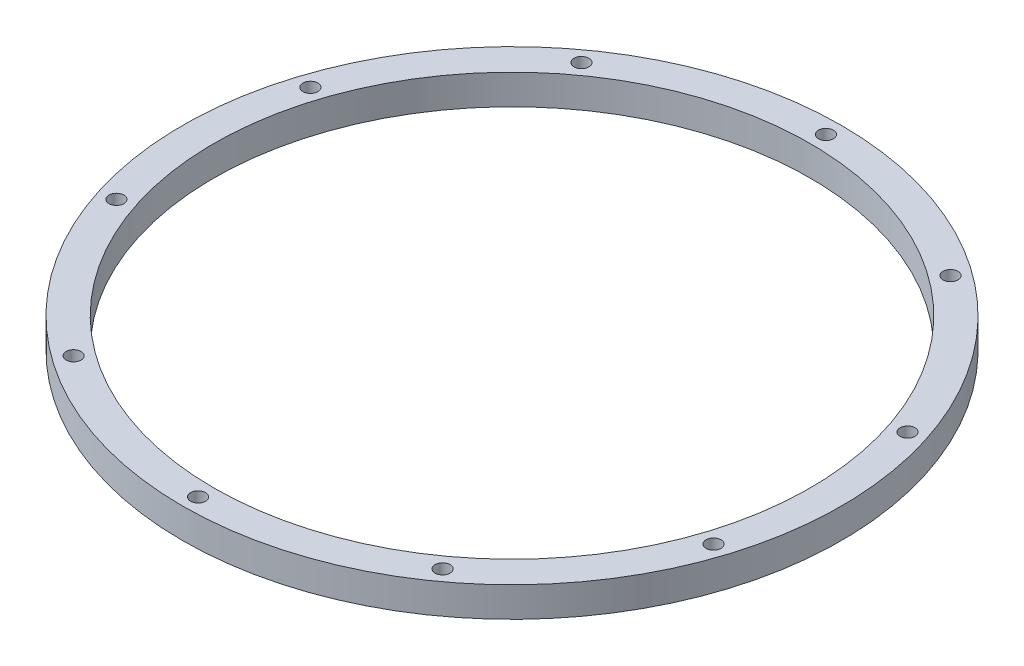
ISO-10303-21;
HEADER;
FILE_DESCRIPTION(('STEP AP214'),'2;1');
FILE_NAME('part.step','',(''),(''),'','','');
FILE_SCHEMA(('AUTOMOTIVE_DESIGN { 1 0 10303 214 1 1 1 1 }'));
ENDSEC;
DATA;
#1=APPLICATION_CONTEXT('core data for automotive mechanical design processes');
#2=APPLICATION_PROTOCOL_DEFINITION('international standard','automotive_design',2000,#1);
#3=PRODUCT_CONTEXT('',#1,'mechanical');
#4=PRODUCT('Part','Part','',(#3));
#5=PRODUCT_RELATED_PRODUCT_CATEGORY('part','',(#4));
#6=PRODUCT_DEFINITION_FORMATION('','',#4);
#7=PRODUCT_DEFINITION_CONTEXT('part definition',#1,'design');
#8=PRODUCT_DEFINITION('design','',#6,#7);
#9=PRODUCT_DEFINITION_SHAPE('','',#8);
#10=(LENGTH_UNIT() NAMED_UNIT(*) SI_UNIT(.MILLI.,.METRE.));
#11=(NAMED_UNIT(*) PLANE_ANGLE_UNIT() SI_UNIT($,.RADIAN.));
#12=(NAMED_UNIT(*) SI_UNIT($,.STERADIAN.) SOLID_ANGLE_UNIT());
#13=UNCERTAINTY_MEASURE_WITH_UNIT(LENGTH_MEASURE(1.E-05),#10,'distance_accuracy_value','');
#14=(GEOMETRIC_REPRESENTATION_CONTEXT(3) GLOBAL_UNCERTAINTY_ASSIGNED_CONTEXT((#13)) GLOBAL_UNIT_ASSIGNED_CONTEXT((#10,
#11,#12)) REPRESENTATION_CONTEXT('',''));
#15=CARTESIAN_POINT('',(0.,0.,0.));
#16=DIRECTION('',(0.,0.,1.));
#17=DIRECTION('',(1.,0.,0.));
#18=AXIS2_PLACEMENT_3D('',#15,#16,#17);
#19=CARTESIAN_POINT('',(0.,22.45,0.));
#20=DIRECTION('',(0.,1.,0.));
#21=DIRECTION('',(0.,0.,1.));
#22=AXIS2_PLACEMENT_3D('',#19,#20,#21);
#23=PLANE('',#22);
#24=CARTESIAN_POINT('',(-138.261785970494,22.45,190.301022501849));
#25=DIRECTION('',(0.,1.,0.));
#26=DIRECTION('',(-0.587785252292462,0.,0.809016994374955));
#27=AXIS2_PLACEMENT_3D('',#24,#25,#26);
#28=CIRCLE('',#27,5.6125);
#29=CARTESIAN_POINT('',(-141.560730698986,22.45,194.841630382778));
#30=VERTEX_POINT('',#29);
#31=EDGE_CURVE('E108',#30,#30,#28,.T.);
#32=ORIENTED_EDGE('',*,*,#31,.F.);
#33=EDGE_LOOP('',(#32));
#34=FACE_BOUND('',#33,.T.);
#35=CARTESIAN_POINT('',(-223.712269045527,22.45,72.6885225018495));
#36=DIRECTION('',(0.,1.,0.));
#37=DIRECTION('',(-0.95105651629515,0.,0.309016994374958));
#38=AXIS2_PLACEMENT_3D('',#35,#36,#37);
#39=CIRCLE('',#38,5.6125);
#40=CARTESIAN_POINT('',(-229.050073743233,22.45,74.422880382779));
#41=VERTEX_POINT('',#40);
#42=EDGE_CURVE('E102',#41,#41,#39,.T.);
#43=ORIENTED_EDGE('',*,*,#42,.F.);
#44=EDGE_LOOP('',(#43));
#45=FACE_BOUND('',#44,.T.);
#46=CARTESIAN_POINT('',(-223.712269045528,22.45,-72.6885225018449));
#47=DIRECTION('',(0.,1.,0.));
#48=DIRECTION('',(-0.951056516295157,0.,-0.309016994374938));
#49=AXIS2_PLACEMENT_3D('',#46,#47,#48);
#50=CIRCLE('',#49,5.6125);
#51=CARTESIAN_POINT('',(-229.050073743235,22.45,-74.4228803827742));
#52=VERTEX_POINT('',#51);
#53=EDGE_CURVE('E96',#52,#52,#50,.T.);
#54=ORIENTED_EDGE('',*,*,#53,.F.);
#55=EDGE_LOOP('',(#54));
#56=FACE_BOUND('',#55,.T.);
#57=CARTESIAN_POINT('',(-138.261785970499,22.45,-190.301022501846));
#58=DIRECTION('',(0.,1.,0.));
#59=DIRECTION('',(-0.58778525229248,0.,-0.809016994374942));
#60=AXIS2_PLACEMENT_3D('',#57,#58,#59);
#61=CIRCLE('',#60,5.6125);
#62=CARTESIAN_POINT('',(-141.56073069899,22.45,-194.841630382775));
#63=VERTEX_POINT('',#62);
#64=EDGE_CURVE('E90',#63,#63,#61,.T.);
#65=ORIENTED_EDGE('',*,*,#64,.F.);
#66=EDGE_LOOP('',(#65));
#67=FACE_BOUND('',#66,.T.);
#68=CARTESIAN_POINT('',(0.,22.45,-235.225));
#69=DIRECTION('',(0.,1.,0.));
#70=DIRECTION('',(0.,0.,-1.));
#71=AXIS2_PLACEMENT_3D('',#68,#69,#70);
#72=CIRCLE('',#71,5.6125);
#73=CARTESIAN_POINT('',(0.,22.45,-240.8375));
#74=VERTEX_POINT('',#73);
#75=EDGE_CURVE('E84',#74,#74,#72,.T.);
#76=ORIENTED_EDGE('',*,*,#75,.F.);
#77=EDGE_LOOP('',(#76));
#78=FACE_BOUND('',#77,.T.);
#79=CARTESIAN_POINT('',(138.261785970496,22.45,-190.301022501848));
#80=DIRECTION('',(0.,1.,0.));
#81=DIRECTION('',(0.587785252292469,0.,-0.809016994374951));
#82=AXIS2_PLACEMENT_3D('',#79,#80,#81);
#83=CIRCLE('',#82,5.6125);
#84=CARTESIAN_POINT('',(141.560730698987,22.45,-194.841630382777));
#85=VERTEX_POINT('',#84);
#86=EDGE_CURVE('E78',#85,#85,#83,.T.);
#87=ORIENTED_EDGE('',*,*,#86,.F.);
#88=EDGE_LOOP('',(#87));
#89=FACE_BOUND('',#88,.T.);
#90=CARTESIAN_POINT('',(223.712269045527,22.45,-72.688522501848));
#91=DIRECTION('',(0.,1.,0.));
#92=DIRECTION('',(0.951056516295152,0.,-0.309016994374952));
#93=AXIS2_PLACEMENT_3D('',#90,#91,#92);
#94=CIRCLE('',#93,5.6125);
#95=CARTESIAN_POINT('',(229.050073743234,22.45,-74.4228803827774));
#96=VERTEX_POINT('',#95);
#97=EDGE_CURVE('E72',#96,#96,#94,.T.);
#98=ORIENTED_EDGE('',*,*,#97,.F.);
#99=EDGE_LOOP('',(#98));
#100=FACE_BOUND('',#99,.T.);
#101=CARTESIAN_POINT('',(223.712269045528,22.45,72.6885225018464));
#102=DIRECTION('',(0.,1.,0.));
#103=DIRECTION('',(0.951056516295155,0.,0.309016994374945));
#104=AXIS2_PLACEMENT_3D('',#101,#102,#103);
#105=CIRCLE('',#104,5.6125);
#106=CARTESIAN_POINT('',(229.050073743234,22.45,74.4228803827758));
#107=VERTEX_POINT('',#106);
#108=EDGE_CURVE('E66',#107,#107,#105,.T.);
#109=ORIENTED_EDGE('',*,*,#108,.F.);
#110=EDGE_LOOP('',(#109));
#111=FACE_BOUND('',#110,.T.);
#112=CARTESIAN_POINT('',(138.261785970497,22.45,190.301022501847));
#113=DIRECTION('',(0.,1.,0.));
#114=DIRECTION('',(0.587785252292474,0.,0.809016994374947));
#115=AXIS2_PLACEMENT_3D('',#112,#113,#114);
#116=CIRCLE('',#115,5.6125);
#117=CARTESIAN_POINT('',(141.560730698989,22.45,194.841630382776));
#118=VERTEX_POINT('',#117);
#119=EDGE_CURVE('E60',#118,#118,#116,.T.);
#120=ORIENTED_EDGE('',*,*,#119,.F.);
#121=EDGE_LOOP('',(#120));
#122=FACE_BOUND('',#121,.T.);
#123=CARTESIAN_POINT('',(0.,22.45,235.225));
#124=DIRECTION('',(0.,1.,0.));
#125=DIRECTION('',(0.,0.,1.));
#126=AXIS2_PLACEMENT_3D('',#123,#124,#125);
#127=CIRCLE('',#126,5.6125);
#128=CARTESIAN_POINT('',(0.,22.45,240.8375));
#129=VERTEX_POINT('',#128);
#130=EDGE_CURVE('E54',#129,#129,#127,.T.);
#131=ORIENTED_EDGE('',*,*,#130,.F.);
#132=EDGE_LOOP('',(#131));
#133=FACE_BOUND('',#132,.T.);
#134=CARTESIAN_POINT('',(0.,22.45,0.));
#135=DIRECTION('',(0.,1.,0.));
#136=DIRECTION('',(0.,0.,1.));
#137=AXIS2_PLACEMENT_3D('',#134,#135,#136);
#138=CIRCLE('',#137,246.95);
#139=CARTESIAN_POINT('',(0.,22.45,246.95));
#140=VERTEX_POINT('',#139);
#141=EDGE_CURVE('E11',#140,#140,#138,.T.);
#142=ORIENTED_EDGE('',*,*,#141,.T.);
#143=EDGE_LOOP('',(#142));
#144=FACE_BOUND('',#143,.T.);
#145=CARTESIAN_POINT('',(0.,22.45,0.));
#146=DIRECTION('',(0.,1.,0.));
#147=DIRECTION('',(0.,0.,1.));
#148=AXIS2_PLACEMENT_3D('',#145,#146,#147);
#149=CIRCLE('',#148,223.5);
#150=CARTESIAN_POINT('',(0.,22.45,223.5));
#151=VERTEX_POINT('',#150);
#152=EDGE_CURVE('E49',#151,#151,#149,.T.);
#153=ORIENTED_EDGE('',*,*,#152,.F.);
#154=EDGE_LOOP('',(#153));
#155=FACE_BOUND('',#154,.T.);
#156=ADVANCED_FACE('F38',(#34,#45,#56,#67,#78,#89,#100,#111,#122,#133,#144,#155),#23,.T.);
#157=CARTESIAN_POINT('',(0.,0.,0.));
#158=DIRECTION('',(0.,1.,0.));
#159=DIRECTION('',(0.,0.,1.));
#160=AXIS2_PLACEMENT_3D('',#157,#158,#159);
#161=PLANE('',#160);
#162=CARTESIAN_POINT('',(-138.261785970494,0.,190.301022501849));
#163=DIRECTION('',(0.,1.,0.));
#164=DIRECTION('',(-0.587785252292462,0.,0.809016994374955));
#165=AXIS2_PLACEMENT_3D('',#162,#163,#164);
#166=CIRCLE('',#165,5.6125);
#167=CARTESIAN_POINT('',(-141.560730698986,0.,194.841630382778));
#168=VERTEX_POINT('',#167);
#169=EDGE_CURVE('E111',#168,#168,#166,.T.);
#170=ORIENTED_EDGE('',*,*,#169,.T.);
#171=EDGE_LOOP('',(#170));
#172=FACE_BOUND('',#171,.T.);
#173=CARTESIAN_POINT('',(-223.712269045527,0.,72.6885225018495));
#174=DIRECTION('',(0.,1.,0.));
#175=DIRECTION('',(-0.95105651629515,0.,0.309016994374958));
#176=AXIS2_PLACEMENT_3D('',#173,#174,#175);
#177=CIRCLE('',#176,5.6125);
#178=CARTESIAN_POINT('',(-229.050073743233,0.,74.422880382779));
#179=VERTEX_POINT('',#178);
#180=EDGE_CURVE('E105',#179,#179,#177,.T.);
#181=ORIENTED_EDGE('',*,*,#180,.T.);
#182=EDGE_LOOP('',(#181));
#183=FACE_BOUND('',#182,.T.);
#184=CARTESIAN_POINT('',(-223.712269045528,0.,-72.6885225018449));
#185=DIRECTION('',(0.,1.,0.));
#186=DIRECTION('',(-0.951056516295157,0.,-0.309016994374938));
#187=AXIS2_PLACEMENT_3D('',#184,#185,#186);
#188=CIRCLE('',#187,5.6125);
#189=CARTESIAN_POINT('',(-229.050073743235,0.,-74.4228803827742));
#190=VERTEX_POINT('',#189);
#191=EDGE_CURVE('E99',#190,#190,#188,.T.);
#192=ORIENTED_EDGE('',*,*,#191,.T.);
#193=EDGE_LOOP('',(#192));
#194=FACE_BOUND('',#193,.T.);
#195=CARTESIAN_POINT('',(-138.261785970499,0.,-190.301022501846));
#196=DIRECTION('',(0.,1.,0.));
#197=DIRECTION('',(-0.58778525229248,0.,-0.809016994374942));
#198=AXIS2_PLACEMENT_3D('',#195,#196,#197);
#199=CIRCLE('',#198,5.6125);
#200=CARTESIAN_POINT('',(-141.56073069899,0.,-194.841630382775));
#201=VERTEX_POINT('',#200);
#202=EDGE_CURVE('E93',#201,#201,#199,.T.);
#203=ORIENTED_EDGE('',*,*,#202,.T.);
#204=EDGE_LOOP('',(#203));
#205=FACE_BOUND('',#204,.T.);
#206=CARTESIAN_POINT('',(0.,0.,-235.225));
#207=DIRECTION('',(0.,1.,0.));
#208=DIRECTION('',(0.,0.,-1.));
#209=AXIS2_PLACEMENT_3D('',#206,#207,#208);
#210=CIRCLE('',#209,5.6125);
#211=CARTESIAN_POINT('',(0.,0.,-240.8375));
#212=VERTEX_POINT('',#211);
#213=EDGE_CURVE('E87',#212,#212,#210,.T.);
#214=ORIENTED_EDGE('',*,*,#213,.T.);
#215=EDGE_LOOP('',(#214));
#216=FACE_BOUND('',#215,.T.);
#217=CARTESIAN_POINT('',(138.261785970496,0.,-190.301022501848));
#218=DIRECTION('',(0.,1.,0.));
#219=DIRECTION('',(0.587785252292469,0.,-0.809016994374951));
#220=AXIS2_PLACEMENT_3D('',#217,#218,#219);
#221=CIRCLE('',#220,5.6125);
#222=CARTESIAN_POINT('',(141.560730698987,0.,-194.841630382777));
#223=VERTEX_POINT('',#222);
#224=EDGE_CURVE('E81',#223,#223,#221,.T.);
#225=ORIENTED_EDGE('',*,*,#224,.T.);
#226=EDGE_LOOP('',(#225));
#227=FACE_BOUND('',#226,.T.);
#228=CARTESIAN_POINT('',(223.712269045527,0.,-72.688522501848));
#229=DIRECTION('',(0.,1.,0.));
#230=DIRECTION('',(0.951056516295152,0.,-0.309016994374952));
#231=AXIS2_PLACEMENT_3D('',#228,#229,#230);
#232=CIRCLE('',#231,5.6125);
#233=CARTESIAN_POINT('',(229.050073743234,0.,-74.4228803827774));
#234=VERTEX_POINT('',#233);
#235=EDGE_CURVE('E75',#234,#234,#232,.T.);
#236=ORIENTED_EDGE('',*,*,#235,.T.);
#237=EDGE_LOOP('',(#236));
#238=FACE_BOUND('',#237,.T.);
#239=CARTESIAN_POINT('',(223.712269045528,0.,72.6885225018464));
#240=DIRECTION('',(0.,1.,0.));
#241=DIRECTION('',(0.951056516295155,0.,0.309016994374945));
#242=AXIS2_PLACEMENT_3D('',#239,#240,#241);
#243=CIRCLE('',#242,5.6125);
#244=CARTESIAN_POINT('',(229.050073743234,0.,74.4228803827758));
#245=VERTEX_POINT('',#244);
#246=EDGE_CURVE('E69',#245,#245,#243,.T.);
#247=ORIENTED_EDGE('',*,*,#246,.T.);
#248=EDGE_LOOP('',(#247));
#249=FACE_BOUND('',#248,.T.);
#250=CARTESIAN_POINT('',(138.261785970497,0.,190.301022501847));
#251=DIRECTION('',(0.,1.,0.));
#252=DIRECTION('',(0.587785252292474,0.,0.809016994374947));
#253=AXIS2_PLACEMENT_3D('',#250,#251,#252);
#254=CIRCLE('',#253,5.6125);
#255=CARTESIAN_POINT('',(141.560730698989,0.,194.841630382776));
#256=VERTEX_POINT('',#255);
#257=EDGE_CURVE('E63',#256,#256,#254,.T.);
#258=ORIENTED_EDGE('',*,*,#257,.T.);
#259=EDGE_LOOP('',(#258));
#260=FACE_BOUND('',#259,.T.);
#261=CARTESIAN_POINT('',(0.,0.,235.225));
#262=DIRECTION('',(0.,1.,0.));
#263=DIRECTION('',(0.,0.,1.));
#264=AXIS2_PLACEMENT_3D('',#261,#262,#263);
#265=CIRCLE('',#264,5.6125);
#266=CARTESIAN_POINT('',(0.,0.,240.8375));
#267=VERTEX_POINT('',#266);
#268=EDGE_CURVE('E57',#267,#267,#265,.T.);
#269=ORIENTED_EDGE('',*,*,#268,.T.);
#270=EDGE_LOOP('',(#269));
#271=FACE_BOUND('',#270,.T.);
#272=CARTESIAN_POINT('',(0.,0.,0.));
#273=DIRECTION('',(0.,1.,0.));
#274=DIRECTION('',(0.,0.,1.));
#275=AXIS2_PLACEMENT_3D('',#272,#273,#274);
#276=CIRCLE('',#275,246.95);
#277=CARTESIAN_POINT('',(0.,0.,246.95));
#278=VERTEX_POINT('',#277);
#279=EDGE_CURVE('E42',#278,#278,#276,.T.);
#280=ORIENTED_EDGE('',*,*,#279,.F.);
#281=EDGE_LOOP('',(#280));
#282=FACE_BOUND('',#281,.T.);
#283=CARTESIAN_POINT('',(0.,0.,0.));
#284=DIRECTION('',(0.,1.,0.));
#285=DIRECTION('',(0.,0.,1.));
#286=AXIS2_PLACEMENT_3D('',#283,#284,#285);
#287=CIRCLE('',#286,223.5);
#288=CARTESIAN_POINT('',(0.,0.,223.5));
#289=VERTEX_POINT('',#288);
#290=EDGE_CURVE('E51',#289,#289,#287,.T.);
#291=ORIENTED_EDGE('',*,*,#290,.T.);
#292=EDGE_LOOP('',(#291));
#293=FACE_BOUND('',#292,.T.);
#294=ADVANCED_FACE('F122',(#172,#183,#194,#205,#216,#227,#238,#249,#260,#271,#282,#293),#161,.F.);
#295=CARTESIAN_POINT('',(0.,22.45,0.));
#296=DIRECTION('',(0.,-1.,0.));
#297=DIRECTION('',(0.,0.,-1.));
#298=AXIS2_PLACEMENT_3D('',#295,#296,#297);
#299=CYLINDRICAL_SURFACE('',#298,246.95);
#300=ORIENTED_EDGE('',*,*,#141,.F.);
#301=EDGE_LOOP('',(#300));
#302=FACE_BOUND('',#301,.T.);
#303=ORIENTED_EDGE('',*,*,#279,.T.);
#304=EDGE_LOOP('',(#303));
#305=FACE_BOUND('',#304,.T.);
#306=ADVANCED_FACE('F40',(#302,#305),#299,.T.);
#307=CARTESIAN_POINT('',(0.,22.45,0.));
#308=DIRECTION('',(0.,-1.,0.));
#309=DIRECTION('',(0.,0.,-1.));
#310=AXIS2_PLACEMENT_3D('',#307,#308,#309);
#311=CYLINDRICAL_SURFACE('',#310,223.5);
#312=ORIENTED_EDGE('',*,*,#152,.T.);
#313=EDGE_LOOP('',(#312));
#314=FACE_BOUND('',#313,.T.);
#315=ORIENTED_EDGE('',*,*,#290,.F.);
#316=EDGE_LOOP('',(#315));
#317=FACE_BOUND('',#316,.T.);
#318=ADVANCED_FACE('F144',(#314,#317),#311,.F.);
#319=CARTESIAN_POINT('',(0.,22.45,235.225));
#320=DIRECTION('',(0.,-1.,0.));
#321=DIRECTION('',(0.,0.,-1.));
#322=AXIS2_PLACEMENT_3D('',#319,#320,#321);
#323=CYLINDRICAL_SURFACE('',#322,5.6125);
#324=ORIENTED_EDGE('',*,*,#130,.T.);
#325=EDGE_LOOP('',(#324));
#326=FACE_BOUND('',#325,.T.);
#327=ORIENTED_EDGE('',*,*,#268,.F.);
#328=EDGE_LOOP('',(#327));
#329=FACE_BOUND('',#328,.T.);
#330=ADVANCED_FACE('F147',(#326,#329),#323,.F.);
#331=CARTESIAN_POINT('',(138.261785970497,22.45,190.301022501847));
#332=DIRECTION('',(0.,-1.,0.));
#333=DIRECTION('',(0.,0.,-1.));
#334=AXIS2_PLACEMENT_3D('',#331,#332,#333);
#335=CYLINDRICAL_SURFACE('',#334,5.6125);
#336=ORIENTED_EDGE('',*,*,#119,.T.);
#337=EDGE_LOOP('',(#336));
#338=FACE_BOUND('',#337,.T.);
#339=ORIENTED_EDGE('',*,*,#257,.F.);
#340=EDGE_LOOP('',(#339));
#341=FACE_BOUND('',#340,.T.);
#342=ADVANCED_FACE('F161',(#338,#341),#335,.F.);
#343=CARTESIAN_POINT('',(223.712269045528,22.45,72.6885225018464));
#344=DIRECTION('',(0.,-1.,0.));
#345=DIRECTION('',(0.,0.,-1.));
#346=AXIS2_PLACEMENT_3D('',#343,#344,#345);
#347=CYLINDRICAL_SURFACE('',#346,5.6125);
#348=ORIENTED_EDGE('',*,*,#108,.T.);
#349=EDGE_LOOP('',(#348));
#350=FACE_BOUND('',#349,.T.);
#351=ORIENTED_EDGE('',*,*,#246,.F.);
#352=EDGE_LOOP('',(#351));
#353=FACE_BOUND('',#352,.T.);
#354=ADVANCED_FACE('F165',(#350,#353),#347,.F.);
#355=CARTESIAN_POINT('',(223.712269045527,22.45,-72.688522501848));
#356=DIRECTION('',(0.,-1.,0.));
#357=DIRECTION('',(0.,0.,-1.));
#358=AXIS2_PLACEMENT_3D('',#355,#356,#357);
#359=CYLINDRICAL_SURFACE('',#358,5.6125);
#360=ORIENTED_EDGE('',*,*,#97,.T.);
#361=EDGE_LOOP('',(#360));
#362=FACE_BOUND('',#361,.T.);
#363=ORIENTED_EDGE('',*,*,#235,.F.);
#364=EDGE_LOOP('',(#363));
#365=FACE_BOUND('',#364,.T.);
#366=ADVANCED_FACE('F169',(#362,#365),#359,.F.);
#367=CARTESIAN_POINT('',(138.261785970496,22.45,-190.301022501848));
#368=DIRECTION('',(0.,-1.,0.));
#369=DIRECTION('',(0.,0.,-1.));
#370=AXIS2_PLACEMENT_3D('',#367,#368,#369);
#371=CYLINDRICAL_SURFACE('',#370,5.6125);
#372=ORIENTED_EDGE('',*,*,#86,.T.);
#373=EDGE_LOOP('',(#372));
#374=FACE_BOUND('',#373,.T.);
#375=ORIENTED_EDGE('',*,*,#224,.F.);
#376=EDGE_LOOP('',(#375));
#377=FACE_BOUND('',#376,.T.);
#378=ADVANCED_FACE('F173',(#374,#377),#371,.F.);
#379=CARTESIAN_POINT('',(0.,22.45,-235.225));
#380=DIRECTION('',(0.,-1.,0.));
#381=DIRECTION('',(0.,0.,-1.));
#382=AXIS2_PLACEMENT_3D('',#379,#380,#381);
#383=CYLINDRICAL_SURFACE('',#382,5.6125);
#384=ORIENTED_EDGE('',*,*,#75,.T.);
#385=EDGE_LOOP('',(#384));
#386=FACE_BOUND('',#385,.T.);
#387=ORIENTED_EDGE('',*,*,#213,.F.);
#388=EDGE_LOOP('',(#387));
#389=FACE_BOUND('',#388,.T.);
#390=ADVANCED_FACE('F177',(#386,#389),#383,.F.);
#391=CARTESIAN_POINT('',(-138.261785970499,22.45,-190.301022501846));
#392=DIRECTION('',(0.,-1.,0.));
#393=DIRECTION('',(0.,0.,-1.));
#394=AXIS2_PLACEMENT_3D('',#391,#392,#393);
#395=CYLINDRICAL_SURFACE('',#394,5.6125);
#396=ORIENTED_EDGE('',*,*,#64,.T.);
#397=EDGE_LOOP('',(#396));
#398=FACE_BOUND('',#397,.T.);
#399=ORIENTED_EDGE('',*,*,#202,.F.);
#400=EDGE_LOOP('',(#399));
#401=FACE_BOUND('',#400,.T.);
#402=ADVANCED_FACE('F181',(#398,#401),#395,.F.);
#403=CARTESIAN_POINT('',(-223.712269045528,22.45,-72.6885225018449));
#404=DIRECTION('',(0.,-1.,0.));
#405=DIRECTION('',(0.,0.,-1.));
#406=AXIS2_PLACEMENT_3D('',#403,#404,#405);
#407=CYLINDRICAL_SURFACE('',#406,5.6125);
#408=ORIENTED_EDGE('',*,*,#53,.T.);
#409=EDGE_LOOP('',(#408));
#410=FACE_BOUND('',#409,.T.);
#411=ORIENTED_EDGE('',*,*,#191,.F.);
#412=EDGE_LOOP('',(#411));
#413=FACE_BOUND('',#412,.T.);
#414=ADVANCED_FACE('F185',(#410,#413),#407,.F.);
#415=CARTESIAN_POINT('',(-223.712269045527,22.45,72.6885225018495));
#416=DIRECTION('',(0.,-1.,0.));
#417=DIRECTION('',(0.,0.,-1.));
#418=AXIS2_PLACEMENT_3D('',#415,#416,#417);
#419=CYLINDRICAL_SURFACE('',#418,5.6125);
#420=ORIENTED_EDGE('',*,*,#42,.T.);
#421=EDGE_LOOP('',(#420));
#422=FACE_BOUND('',#421,.T.);
#423=ORIENTED_EDGE('',*,*,#180,.F.);
#424=EDGE_LOOP('',(#423));
#425=FACE_BOUND('',#424,.T.);
#426=ADVANCED_FACE('F189',(#422,#425),#419,.F.);
#427=CARTESIAN_POINT('',(-138.261785970494,22.45,190.301022501849));
#428=DIRECTION('',(0.,-1.,0.));
#429=DIRECTION('',(0.,0.,-1.));
#430=AXIS2_PLACEMENT_3D('',#427,#428,#429);
#431=CYLINDRICAL_SURFACE('',#430,5.6125);
#432=ORIENTED_EDGE('',*,*,#31,.T.);
#433=EDGE_LOOP('',(#432));
#434=FACE_BOUND('',#433,.T.);
#435=ORIENTED_EDGE('',*,*,#169,.F.);
#436=EDGE_LOOP('',(#435));
#437=FACE_BOUND('',#436,.T.);
#438=ADVANCED_FACE('F117',(#434,#437),#431,.F.);
#439=CLOSED_SHELL('',(#156,#294,#306,#318,#330,#342,#354,#366,#378,#390,#402,#414,#426,#438));
#440=MANIFOLD_SOLID_BREP('B2',#439);
#441=ADVANCED_BREP_SHAPE_REPRESENTATION('',(#18,#440),#14);
#442=SHAPE_DEFINITION_REPRESENTATION(#9,#441);
ENDSEC;
END-ISO-10303-21;
